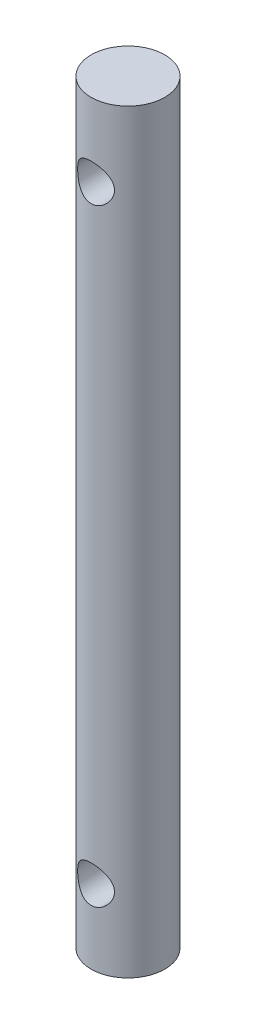
ISO-10303-21;
HEADER;
FILE_DESCRIPTION(('STEP AP214'),'2;1');
FILE_NAME('part.step','',(''),(''),'','','');
FILE_SCHEMA(('AUTOMOTIVE_DESIGN { 1 0 10303 214 1 1 1 1 }'));
ENDSEC;
DATA;
#1=APPLICATION_CONTEXT('core data for automotive mechanical design processes');
#2=APPLICATION_PROTOCOL_DEFINITION('international standard','automotive_design',2000,#1);
#3=PRODUCT_CONTEXT('',#1,'mechanical');
#4=PRODUCT('Part','Part','',(#3));
#5=PRODUCT_RELATED_PRODUCT_CATEGORY('part','',(#4));
#6=PRODUCT_DEFINITION_FORMATION('','',#4);
#7=PRODUCT_DEFINITION_CONTEXT('part definition',#1,'design');
#8=PRODUCT_DEFINITION('design','',#6,#7);
#9=PRODUCT_DEFINITION_SHAPE('','',#8);
#10=(LENGTH_UNIT() NAMED_UNIT(*) SI_UNIT(.MILLI.,.METRE.));
#11=(NAMED_UNIT(*) PLANE_ANGLE_UNIT() SI_UNIT($,.RADIAN.));
#12=(NAMED_UNIT(*) SI_UNIT($,.STERADIAN.) SOLID_ANGLE_UNIT());
#13=UNCERTAINTY_MEASURE_WITH_UNIT(LENGTH_MEASURE(1.E-05),#10,'distance_accuracy_value','');
#14=(GEOMETRIC_REPRESENTATION_CONTEXT(3) GLOBAL_UNCERTAINTY_ASSIGNED_CONTEXT((#13)) GLOBAL_UNIT_ASSIGNED_CONTEXT((#10,
#11,#12)) REPRESENTATION_CONTEXT('',''));
#15=CARTESIAN_POINT('',(0.,0.,0.));
#16=DIRECTION('',(0.,0.,1.));
#17=DIRECTION('',(1.,0.,0.));
#18=AXIS2_PLACEMENT_3D('',#15,#16,#17);
#19=CARTESIAN_POINT('',(0.,130.175,0.767844395721253));
#20=DIRECTION('',(0.,-1.,0.));
#21=DIRECTION('',(0.,0.,-1.));
#22=AXIS2_PLACEMENT_3D('',#19,#20,#21);
#23=CYLINDRICAL_SURFACE('',#22,6.35);
#24=CARTESIAN_POINT('',(0.,120.65,-5.58215560427875));
#25=CARTESIAN_POINT('',(-0.0834969220595,120.649999112282,-5.58215491594319));
#26=CARTESIAN_POINT('',(-0.167002655580043,120.646700125554,-5.58050319339576));
#27=CARTESIAN_POINT('',(-0.333378330258782,120.63355412545,-5.57394666249589));
#28=CARTESIAN_POINT('',(-0.416247978955772,120.623704263474,-5.56904043894988));
#29=CARTESIAN_POINT('',(-0.66318203064701,120.584427934954,-5.549579871762));
#30=CARTESIAN_POINT('',(-0.825450146761555,120.545274922599,-5.53028387727299));
#31=CARTESIAN_POINT('',(-1.13965128900426,120.443009288706,-5.48107383563615));
#32=CARTESIAN_POINT('',(-1.29162180811869,120.379989780757,-5.451201082147));
#33=CARTESIAN_POINT('',(-1.58264035037879,120.232263926371,-5.38358372469512));
#34=CARTESIAN_POINT('',(-1.72168939123018,120.147559289849,-5.34583974143752));
#35=CARTESIAN_POINT('',(-1.99234108848171,119.953030370266,-5.26326656610857));
#36=CARTESIAN_POINT('',(-2.12298433900091,119.841996422206,-5.21814687698693));
#37=CARTESIAN_POINT('',(-2.36467069069853,119.600603316427,-5.12686096018931));
#38=CARTESIAN_POINT('',(-2.47569885601321,119.470229570234,-5.08069396496918));
#39=CARTESIAN_POINT('',(-2.68368848497886,119.181579052247,-4.98839195362339));
#40=CARTESIAN_POINT('',(-2.77889135161933,119.021922468698,-4.94253706604663));
#41=CARTESIAN_POINT('',(-2.90019349951535,118.770452012826,-4.88135319714238));
#42=CARTESIAN_POINT('',(-2.93705266116892,118.684599938171,-4.86221981233807));
#43=CARTESIAN_POINT('',(-3.00322508739606,118.509414386294,-4.82720165281142));
#44=CARTESIAN_POINT('',(-3.03254280972159,118.420083001819,-4.81131496011303));
#45=CARTESIAN_POINT('',(-3.08174263292982,118.243989448035,-4.78428172062924));
#46=CARTESIAN_POINT('',(-3.10208128111978,118.157389205971,-4.77290989565621));
#47=CARTESIAN_POINT('',(-3.13545600360765,117.982412721006,-4.75409215314319));
#48=CARTESIAN_POINT('',(-3.14849595237257,117.894037446228,-4.7466441527901));
#49=CARTESIAN_POINT('',(-3.1670771305344,117.716293261151,-4.73599436210793));
#50=CARTESIAN_POINT('',(-3.17262287599649,117.626924982013,-4.73279001454397));
#51=CARTESIAN_POINT('',(-3.17614778806993,117.448019215822,-4.73075348826484));
#52=CARTESIAN_POINT('',(-3.17412767659871,117.358481745729,-4.73192089240673));
#53=CARTESIAN_POINT('',(-3.1581193033026,117.112252124276,-4.74114750790607));
#54=CARTESIAN_POINT('',(-3.13621253452965,116.956158270187,-4.75376417785582));
#55=CARTESIAN_POINT('',(-3.07003746372168,116.650353358693,-4.79082053480699));
#56=CARTESIAN_POINT('',(-3.02576203854504,116.500644350977,-4.81526398785951));
#57=CARTESIAN_POINT('',(-2.91531509833647,116.207455703436,-4.87373445835111));
#58=CARTESIAN_POINT('',(-2.84865758129417,116.064202390063,-4.90797144304004));
#59=CARTESIAN_POINT('',(-2.69570761526053,115.790233913826,-4.98218829235508));
#60=CARTESIAN_POINT('',(-2.60940634674629,115.659524420391,-5.02217073355679));
#61=CARTESIAN_POINT('',(-2.40685964249565,115.39689572575,-5.10949849446486));
#62=CARTESIAN_POINT('',(-2.28820488335253,115.266924615143,-5.1571345883181));
#63=CARTESIAN_POINT('',(-2.03058898448427,115.027914857136,-5.25029261002779));
#64=CARTESIAN_POINT('',(-1.89161819563547,114.918886213641,-5.29581351966033));
#65=CARTESIAN_POINT('',(-1.58913989972483,114.72009808028,-5.38219371025554));
#66=CARTESIAN_POINT('',(-1.42479265164789,114.63146851442,-5.42273835402447));
#67=CARTESIAN_POINT('',(-1.08098023585583,114.483841918365,-5.49191832727827));
#68=CARTESIAN_POINT('',(-0.901527205073896,114.424821358868,-5.52056311006821));
#69=CARTESIAN_POINT('',(-0.548533610626833,114.342940596601,-5.56070320118232));
#70=CARTESIAN_POINT('',(-0.375734359385244,114.317490327413,-5.5734223955087));
#71=CARTESIAN_POINT('',(-0.0278752299448303,114.29534947774,-5.584473781442));
#72=CARTESIAN_POINT('',(0.14718353806002,114.298645272861,-5.58281278864004));
#73=CARTESIAN_POINT('',(0.480164686080363,114.332406235945,-5.56600095836274));
#74=CARTESIAN_POINT('',(0.638363620564191,114.360745791475,-5.55190565488306));
#75=CARTESIAN_POINT('',(0.947441883053001,114.44045587821,-5.51300954351996));
#76=CARTESIAN_POINT('',(1.09832040207141,114.491828948477,-5.4882075554139));
#77=CARTESIAN_POINT('',(1.39347133182512,114.617495130938,-5.42925558664208));
#78=CARTESIAN_POINT('',(1.53743151047821,114.692401584111,-5.39485860038592));
#79=CARTESIAN_POINT('',(1.8112148234104,114.862316425686,-5.32002678893539));
#80=CARTESIAN_POINT('',(1.94103189959927,114.957333377385,-5.27958939382555));
#81=CARTESIAN_POINT('',(2.19636241342679,115.175539350374,-5.19189163137813));
#82=CARTESIAN_POINT('',(2.32020134681979,115.300578607112,-5.14435119678973));
#83=CARTESIAN_POINT('',(2.54589381918873,115.56976235515,-5.05073653659243));
#84=CARTESIAN_POINT('',(2.6477321493525,115.713919952381,-5.00466334391422));
#85=CARTESIAN_POINT('',(2.83117262876716,116.026068601958,-4.91703095716617));
#86=CARTESIAN_POINT('',(2.91155594998014,116.19487576951,-4.87579841869696));
#87=CARTESIAN_POINT('',(3.04191297152938,116.54634446489,-4.80663239965195));
#88=CARTESIAN_POINT('',(3.09192585492219,116.728987797847,-4.77868179328743));
#89=CARTESIAN_POINT('',(3.15551086037917,117.08418995647,-4.74273326142478));
#90=CARTESIAN_POINT('',(3.17212027309711,117.256033750407,-4.73307752771119));
#91=CARTESIAN_POINT('',(3.17718805563876,117.600244442495,-4.73015561573233));
#92=CARTESIAN_POINT('',(3.16565862768386,117.772611081543,-4.73688233332315));
#93=CARTESIAN_POINT('',(3.11761548073658,118.095660103074,-4.76420771905659));
#94=CARTESIAN_POINT('',(3.08358651207686,118.246843941731,-4.78342383504144));
#95=CARTESIAN_POINT('',(2.99458164828807,118.541190830167,-4.83193538730456));
#96=CARTESIAN_POINT('',(2.93959901505999,118.68435128285,-4.8612340655521));
#97=CARTESIAN_POINT('',(2.8061154442137,118.969233699429,-4.92901136765049));
#98=CARTESIAN_POINT('',(2.72628260503929,119.110212809366,-4.96797449908407));
#99=CARTESIAN_POINT('',(2.54682759156583,119.377697431723,-5.04987767510257));
#100=CARTESIAN_POINT('',(2.44719512169931,119.504195359943,-5.09281978248005));
#101=CARTESIAN_POINT('',(2.21680287661219,119.755097524177,-5.18408314189078));
#102=CARTESIAN_POINT('',(2.08373188558713,119.877379756413,-5.23242400305221));
#103=CARTESIAN_POINT('',(1.79751265125244,120.098397873233,-5.32427906004624));
#104=CARTESIAN_POINT('',(1.64435365457428,120.197121065983,-5.36779064750917));
#105=CARTESIAN_POINT('',(1.40178715704488,120.325280266197,-5.42606633618117));
#106=CARTESIAN_POINT('',(1.31842200030919,120.364800583681,-5.44438733699258));
#107=CARTESIAN_POINT('',(1.14807701021671,120.436599474824,-5.47810923903478));
#108=CARTESIAN_POINT('',(1.06109897786307,120.468881606534,-5.49351157440578));
#109=CARTESIAN_POINT('',(0.884361322813113,120.525759345915,-5.52090657539856));
#110=CARTESIAN_POINT('',(0.794608244970577,120.550371718138,-5.53290667237353));
#111=CARTESIAN_POINT('',(0.612925661591586,120.59166738953,-5.55316543999778));
#112=CARTESIAN_POINT('',(0.520997521680293,120.608355532194,-5.56142639596235));
#113=CARTESIAN_POINT('',(0.357531347524377,120.630616284862,-5.57248063691209));
#114=CARTESIAN_POINT('',(0.286274046488598,120.63787882125,-5.57610231240764));
#115=CARTESIAN_POINT('',(0.143346668941348,120.647571126538,-5.58094012473442));
#116=CARTESIAN_POINT('',(0.0716765810914264,120.650000762047,-5.58215619516927));
#117=CARTESIAN_POINT('',(0.,120.65,-5.58215560427875));
#118=B_SPLINE_CURVE_WITH_KNOTS('',3,(#24,#25,#26,#27,#28,#29,#30,#31,#32,#33,#34,#35,#36,#37,
#38,#39,#40,#41,#42,#43,#44,#45,#46,#47,#48,#49,#50,#51,#52,#53,#54,#55,#56,#57,#58,#59,#60,#61,
#62,#63,#64,#65,#66,#67,#68,#69,#70,#71,#72,#73,#74,#75,#76,#77,#78,#79,#80,#81,#82,#83,#84,#85,
#86,#87,#88,#89,#90,#91,#92,#93,#94,#95,#96,#97,#98,#99,#100,#101,#102,#103,#104,#105,#106,#107,
#108,#109,#110,#111,#112,#113,#114,#115,#116,#117),.UNSPECIFIED.,.T.,.F.,(4,2,2,2,2,2,2,2,2,2,2,
2,2,2,2,2,2,2,2,2,2,2,2,2,2,2,2,2,2,2,2,2,2,2,2,2,2,2,2,2,2,2,2,2,2,2,4),(0.,0.250415612102681,
0.500940186864015,1.00234854488129,1.50182051324263,2.00125310940106,2.53090025348452,
3.06094897410614,3.632102983731,3.9178729000599,4.20347350732851,4.47213270490101,
4.74064915090148,5.00900371453885,5.27733267302574,5.74927594687737,6.22136960256846,
6.70445970327764,7.18776712794021,7.7323564652788,8.27720530143644,8.84735553323665,
9.41705196489304,9.93956405039339,10.4618285011675,10.9436138594975,11.4254523397102,
11.9210677568139,12.4168946391879,12.9614122158798,13.5063050164601,14.0775857365549,
14.6481278321882,15.1639000911419,15.6794487286237,16.1458838633213,16.6124691169503,
17.1104020806943,17.6085946442304,18.1673210354482,18.7263477502426,19.0082017078365,
19.2899168101042,19.5710117490933,19.8519346536844,20.0668939492147,20.2818591776892),.UNSPECIFIED.);
#119=CARTESIAN_POINT('',(0.,120.65,-5.58215560427875));
#120=VERTEX_POINT('',#119);
#121=EDGE_CURVE('E11',#120,#120,#118,.T.);
#122=ORIENTED_EDGE('',*,*,#121,.T.);
#123=EDGE_LOOP('',(#122));
#124=FACE_BOUND('',#123,.T.);
#125=CARTESIAN_POINT('',(3.175,117.475,6.26710570975244));
#126=CARTESIAN_POINT('',(3.17499905676822,117.392238086467,6.26710672449038));
#127=CARTESIAN_POINT('',(3.17175738528249,117.309466084958,6.26898254666068));
#128=CARTESIAN_POINT('',(3.15884523354688,117.144579787141,6.2764051724258));
#129=CARTESIAN_POINT('',(3.1491717603564,117.062465815049,6.28195368504562));
#130=CARTESIAN_POINT('',(3.11062065473092,116.817834251589,6.30386118496228));
#131=CARTESIAN_POINT('',(3.07221261154103,116.657171953019,6.32548162314761));
#132=CARTESIAN_POINT('',(2.97211747978078,116.346402187854,6.37963305070438));
#133=CARTESIAN_POINT('',(2.9105541372517,116.196243559814,6.41210594158755));
#134=CARTESIAN_POINT('',(2.76627435445934,115.9083885772,6.4841998346217));
#135=CARTESIAN_POINT('',(2.68355676984061,115.770692897366,6.52382122344217));
#136=CARTESIAN_POINT('',(2.49131627779835,115.49917617866,6.6097447383962));
#137=CARTESIAN_POINT('',(2.38014521787044,115.366611402718,6.65632834910434));
#138=CARTESIAN_POINT('',(2.13758083606043,115.121029208745,6.74865491632271));
#139=CARTESIAN_POINT('',(2.00617748851801,115.008021541095,6.79439744340407));
#140=CARTESIAN_POINT('',(1.71605436473864,114.79730904715,6.88357626918698));
#141=CARTESIAN_POINT('',(1.55609032527603,114.70114922106,6.92664926918252));
#142=CARTESIAN_POINT('',(1.21969855929244,114.537677856889,7.00198090719364));
#143=CARTESIAN_POINT('',(1.04328130884119,114.470348112814,7.03424636728233));
#144=CARTESIAN_POINT('',(0.692292696730407,114.371422685461,7.08229903885362));
#145=CARTESIAN_POINT('',(0.518483183758185,114.337625253206,7.0990953920244));
#146=CARTESIAN_POINT('',(0.166911747158863,114.299472573822,7.11808518354362));
#147=CARTESIAN_POINT('',(-0.0108477196166707,114.295099512243,7.12028745759956));
#148=CARTESIAN_POINT('',(-0.348718268640207,114.315070701205,7.11031907022859));
#149=CARTESIAN_POINT('',(-0.509019820270684,114.336950743216,7.09938163576222));
#150=CARTESIAN_POINT('',(-0.823321212955326,114.404396635458,7.0662266872537));
#151=CARTESIAN_POINT('',(-0.97732058152526,114.449964258087,7.04400832913163));
#152=CARTESIAN_POINT('',(-1.27733236684466,114.563787314023,6.98994214806944));
#153=CARTESIAN_POINT('',(-1.42320480220676,114.632347920521,6.95796535032441));
#154=CARTESIAN_POINT('',(-1.70172616219331,114.789785720016,6.88726471977041));
#155=CARTESIAN_POINT('',(-1.83437032813194,114.878670186648,6.84853847260754));
#156=CARTESIAN_POINT('',(-2.09605211974366,115.083895301586,6.76365365642933));
#157=CARTESIAN_POINT('',(-2.22356359612796,115.202037090429,6.71713856499948));
#158=CARTESIAN_POINT('',(-2.45777846555886,115.45756239352,6.62427072879644));
#159=CARTESIAN_POINT('',(-2.56446584928023,115.59496057354,6.5779181356239));
#160=CARTESIAN_POINT('',(-2.76069102698817,115.895947768369,6.48741729176472));
#161=CARTESIAN_POINT('',(-2.84870951352546,116.060645911059,6.44359595324914));
#162=CARTESIAN_POINT('',(-2.95849503046443,116.318837566131,6.38669686987964));
#163=CARTESIAN_POINT('',(-2.99138760520285,116.406777928512,6.36919999613122));
#164=CARTESIAN_POINT('',(-3.04938956554735,116.585797438211,6.33783657320752));
#165=CARTESIAN_POINT('',(-3.07450375064138,116.676874611319,6.32396778622354));
#166=CARTESIAN_POINT('',(-3.11492823782859,116.854151631404,6.30139797159841));
#167=CARTESIAN_POINT('',(-3.13085491331031,116.940170642133,6.29237595800693));
#168=CARTESIAN_POINT('',(-3.15556797554225,117.113510627588,6.27829753063591));
#169=CARTESIAN_POINT('',(-3.16435807553686,117.200830901134,6.27323905462891));
#170=CARTESIAN_POINT('',(-3.17466835867006,117.376015148866,6.26730066102777));
#171=CARTESIAN_POINT('',(-3.17619124884848,117.46387890839,6.26641918749866));
#172=CARTESIAN_POINT('',(-3.17195985852084,117.639344837643,6.26885948375424));
#173=CARTESIAN_POINT('',(-3.16620606921981,117.726947024628,6.2721809698223));
#174=CARTESIAN_POINT('',(-3.14018226453033,117.969092585645,6.2871002800797));
#175=CARTESIAN_POINT('',(-3.11209439281023,118.122605607529,6.30313051271152));
#176=CARTESIAN_POINT('',(-3.03433762958359,118.422346880593,6.34612536495718));
#177=CARTESIAN_POINT('',(-2.98466174914483,118.56857275552,6.37309352544235));
#178=CARTESIAN_POINT('',(-2.86273054239685,118.857422626649,6.43637065361084));
#179=CARTESIAN_POINT('',(-2.78953600385261,118.999566132032,6.47305439342265));
#180=CARTESIAN_POINT('',(-2.62346157669833,119.270367184771,6.55130086485765));
#181=CARTESIAN_POINT('',(-2.53057157570877,119.399017753442,6.59286609791076));
#182=CARTESIAN_POINT('',(-2.31405795861388,119.656156871519,6.68248845012277));
#183=CARTESIAN_POINT('',(-2.18803622695199,119.782580761702,6.73070343861806));
#184=CARTESIAN_POINT('',(-1.91580928554187,120.01313404752,6.82365632851185));
#185=CARTESIAN_POINT('',(-1.76959728537412,120.117255912323,6.86839305214996));
#186=CARTESIAN_POINT('',(-1.45584977269244,120.302571526682,6.95088263717487));
#187=CARTESIAN_POINT('',(-1.28785333421913,120.383087636826,6.98842002103909));
#188=CARTESIAN_POINT('',(-0.938283508313609,120.513912858229,7.05064091345011));
#189=CARTESIAN_POINT('',(-0.756722200806244,120.564248493874,7.0753357062863));
#190=CARTESIAN_POINT('',(-0.403160492410786,120.62894519054,7.10728778154941));
#191=CARTESIAN_POINT('',(-0.231811338563333,120.646183264302,7.11593710898784));
#192=CARTESIAN_POINT('',(0.111525009731684,120.652677359425,7.11918203295091));
#193=CARTESIAN_POINT('',(0.28351195976931,120.641943176285,7.11378254917615));
#194=CARTESIAN_POINT('',(0.611308110350747,120.594702940442,7.09034791348881));
#195=CARTESIAN_POINT('',(0.767436553820506,120.559941720137,7.07316882723711));
#196=CARTESIAN_POINT('',(1.07139095342116,120.467986660666,7.02869334372406));
#197=CARTESIAN_POINT('',(1.21921571544173,120.410789604509,7.00139549560217));
#198=CARTESIAN_POINT('',(1.50946910032131,120.273042062138,6.93769279716902));
#199=CARTESIAN_POINT('',(1.65139651176318,120.191597371874,6.90094837306771));
#200=CARTESIAN_POINT('',(1.92016030444461,120.008781845671,6.82219224151419));
#201=CARTESIAN_POINT('',(2.04698971133066,119.907401857745,6.78017811804515));
#202=CARTESIAN_POINT('',(2.29524860659569,119.675926168705,6.69012933822699));
#203=CARTESIAN_POINT('',(2.41488454123001,119.543976768848,6.6419116364774));
#204=CARTESIAN_POINT('',(2.63101905620371,119.261066269459,6.54834093636534));
#205=CARTESIAN_POINT('',(2.7274971667743,119.110088528742,6.50299049833464));
#206=CARTESIAN_POINT('',(2.85396050304135,118.869320518756,6.44056159682021));
#207=CARTESIAN_POINT('',(2.89354057606826,118.785242277294,6.42041563170916));
#208=CARTESIAN_POINT('',(2.96535747654718,118.613392775482,6.38307301647894));
#209=CARTESIAN_POINT('',(2.99759808643801,118.525623445117,6.3658748483282));
#210=CARTESIAN_POINT('',(3.0542719435453,118.347230991575,6.33515626365955));
#211=CARTESIAN_POINT('',(3.07872527562275,118.25661588317,6.3216263995258));
#212=CARTESIAN_POINT('',(3.11956903021308,118.073111521459,6.29878826592036));
#213=CARTESIAN_POINT('',(3.13596509002515,117.980223906026,6.28947704521671));
#214=CARTESIAN_POINT('',(3.15710761797221,117.818536251204,6.27740631722533));
#215=CARTESIAN_POINT('',(3.16381073091702,117.75006632724,6.27355307977905));
#216=CARTESIAN_POINT('',(3.17275746355016,117.612733281387,6.26840226835251));
#217=CARTESIAN_POINT('',(3.17500078490812,117.543870133503,6.26710486534062));
#218=CARTESIAN_POINT('',(3.175,117.475,6.26710570975244));
#219=B_SPLINE_CURVE_WITH_KNOTS('',3,(#125,#126,#127,#128,#129,#130,#131,#132,#133,#134,#135,
#136,#137,#138,#139,#140,#141,#142,#143,#144,#145,#146,#147,#148,#149,#150,#151,#152,#153,#154,
#155,#156,#157,#158,#159,#160,#161,#162,#163,#164,#165,#166,#167,#168,#169,#170,#171,#172,#173,
#174,#175,#176,#177,#178,#179,#180,#181,#182,#183,#184,#185,#186,#187,#188,#189,#190,#191,#192,
#193,#194,#195,#196,#197,#198,#199,#200,#201,#202,#203,#204,#205,#206,#207,#208,#209,#210,#211,
#212,#213,#214,#215,#216,#217,#218),.UNSPECIFIED.,.T.,.F.,(4,2,2,2,2,2,2,2,2,2,2,2,2,2,2,2,2,2,
2,2,2,2,2,2,2,2,2,2,2,2,2,2,2,2,2,2,2,2,2,2,2,2,2,2,2,2,4),(0.,0.248210314193373,
0.496536210172851,0.993616655653378,1.48807751301479,1.98256512428753,2.51783706318106,
3.05337510292795,3.62501229957991,4.19628797710271,4.72691486873111,5.25722047303094,
5.74141031613326,6.22563639342838,6.71656194871308,7.2076634753703,7.74518754975544,
8.28312325280708,8.85521994590916,9.14138502893469,9.42737318655796,9.69083660833536,
9.95416285897608,10.2173910127767,10.4806013985705,10.9489167635524,11.4173838546846,
11.9075481007329,12.3979646273261,12.9502005485241,13.5026226528975,14.0696241997013,
14.6361266987681,15.1506510247058,15.6649951955482,16.1454469295095,16.625967578846,
17.1270402751828,17.6283435455375,18.1795366185793,18.7312151251733,19.0161455987001,
19.3009288973909,19.5849716229022,19.8688153329579,20.075349152287,20.2818967868888),.UNSPECIFIED.);
#220=CARTESIAN_POINT('',(3.175,117.475,6.26710570975244));
#221=VERTEX_POINT('',#220);
#222=EDGE_CURVE('E61',#221,#221,#219,.T.);
#223=ORIENTED_EDGE('',*,*,#222,.T.);
#224=EDGE_LOOP('',(#223));
#225=FACE_BOUND('',#224,.T.);
#226=CARTESIAN_POINT('',(0.,15.875,-5.58215560427875));
#227=CARTESIAN_POINT('',(-0.0834969220594996,15.8749991122824,-5.58215491594319));
#228=CARTESIAN_POINT('',(-0.167002655580042,15.871700125554,-5.58050319339576));
#229=CARTESIAN_POINT('',(-0.33337833025878,15.8585541254501,-5.57394666249589));
#230=CARTESIAN_POINT('',(-0.416247978955771,15.8487042634742,-5.56904043894988));
#231=CARTESIAN_POINT('',(-0.663182030647009,15.809427934954,-5.549579871762));
#232=CARTESIAN_POINT('',(-0.825450146761554,15.7702749225986,-5.53028387727299));
#233=CARTESIAN_POINT('',(-1.13965128900426,15.6680092887058,-5.48107383563615));
#234=CARTESIAN_POINT('',(-1.29162180811868,15.6049897807566,-5.451201082147));
#235=CARTESIAN_POINT('',(-1.58264035037879,15.4572639263711,-5.38358372469512));
#236=CARTESIAN_POINT('',(-1.72168939123018,15.372559289849,-5.34583974143752));
#237=CARTESIAN_POINT('',(-1.99234108848171,15.1780303702658,-5.26326656610857));
#238=CARTESIAN_POINT('',(-2.12298433900091,15.0669964222061,-5.21814687698693));
#239=CARTESIAN_POINT('',(-2.36467069069853,14.8256033164272,-5.12686096018931));
#240=CARTESIAN_POINT('',(-2.47569885601321,14.6952295702336,-5.08069396496918));
#241=CARTESIAN_POINT('',(-2.68368848497886,14.4065790522467,-4.98839195362339));
#242=CARTESIAN_POINT('',(-2.77889135161933,14.2469224686984,-4.94253706604663));
#243=CARTESIAN_POINT('',(-2.90019349951534,13.9954520128256,-4.88135319714238));
#244=CARTESIAN_POINT('',(-2.93705266116891,13.9095999381713,-4.86221981233808));
#245=CARTESIAN_POINT('',(-3.00322508739606,13.7344143862936,-4.82720165281142));
#246=CARTESIAN_POINT('',(-3.03254280972158,13.6450830018194,-4.81131496011304));
#247=CARTESIAN_POINT('',(-3.08174263292982,13.4689894480353,-4.78428172062924));
#248=CARTESIAN_POINT('',(-3.10208128111978,13.3823892059714,-4.77290989565621));
#249=CARTESIAN_POINT('',(-3.13545600360764,13.2074127210056,-4.75409215314319));
#250=CARTESIAN_POINT('',(-3.14849595237257,13.1190374462283,-4.7466441527901));
#251=CARTESIAN_POINT('',(-3.1670771305344,12.9412932611514,-4.73599436210794));
#252=CARTESIAN_POINT('',(-3.17262287599649,12.8519249820126,-4.73279001454397));
#253=CARTESIAN_POINT('',(-3.17614778806993,12.6730192158219,-4.73075348826484));
#254=CARTESIAN_POINT('',(-3.17412767659871,12.5834817457287,-4.73192089240674));
#255=CARTESIAN_POINT('',(-3.1581193033026,12.3372521242756,-4.74114750790608));
#256=CARTESIAN_POINT('',(-3.13621253452965,12.1811582701866,-4.75376417785582));
#257=CARTESIAN_POINT('',(-3.07003746372167,11.8753533586935,-4.79082053480699));
#258=CARTESIAN_POINT('',(-3.02576203854504,11.7256443509772,-4.81526398785952));
#259=CARTESIAN_POINT('',(-2.91531509833646,11.4324557034359,-4.87373445835112));
#260=CARTESIAN_POINT('',(-2.84865758129417,11.2892023900634,-4.90797144304004));
#261=CARTESIAN_POINT('',(-2.69570761526053,11.015233913826,-4.98218829235508));
#262=CARTESIAN_POINT('',(-2.60940634674628,10.8845244203915,-5.02217073355679));
#263=CARTESIAN_POINT('',(-2.40685964249564,10.6218957257497,-5.10949849446486));
#264=CARTESIAN_POINT('',(-2.28820488335252,10.4919246151435,-5.15713458831811));
#265=CARTESIAN_POINT('',(-2.03058898448426,10.2529148571362,-5.2502926100278));
#266=CARTESIAN_POINT('',(-1.89161819563545,10.1438862136413,-5.29581351966033));
#267=CARTESIAN_POINT('',(-1.58913989972482,9.94509808028028,-5.38219371025555));
#268=CARTESIAN_POINT('',(-1.42479265164787,9.85646851442005,-5.42273835402447));
#269=CARTESIAN_POINT('',(-1.08098023585582,9.70884191836465,-5.49191832727827));
#270=CARTESIAN_POINT('',(-0.901527205073886,9.64982135886829,-5.52056311006821));
#271=CARTESIAN_POINT('',(-0.548533610626825,9.56794059660095,-5.56070320118232));
#272=CARTESIAN_POINT('',(-0.375734359385236,9.54249032741266,-5.5734223955087));
#273=CARTESIAN_POINT('',(-0.0278752299448229,9.52034947773974,-5.584473781442));
#274=CARTESIAN_POINT('',(0.147183538060028,9.52364527286068,-5.58281278864004));
#275=CARTESIAN_POINT('',(0.480164686080371,9.55740623594539,-5.56600095836274));
#276=CARTESIAN_POINT('',(0.638363620564199,9.58574579147484,-5.55190565488305));
#277=CARTESIAN_POINT('',(0.947441883053009,9.6654558782099,-5.51300954351996));
#278=CARTESIAN_POINT('',(1.09832040207142,9.71682894847729,-5.4882075554139));
#279=CARTESIAN_POINT('',(1.39347133182513,9.8424951309378,-5.42925558664208));
#280=CARTESIAN_POINT('',(1.53743151047823,9.9174015841112,-5.39485860038592));
#281=CARTESIAN_POINT('',(1.81121482341041,10.0873164256859,-5.32002678893539));
#282=CARTESIAN_POINT('',(1.94103189959928,10.1823333773854,-5.27958939382554));
#283=CARTESIAN_POINT('',(2.1963624134268,10.4005393503738,-5.19189163137813));
#284=CARTESIAN_POINT('',(2.32020134681981,10.5255786071116,-5.14435119678972));
#285=CARTESIAN_POINT('',(2.54589381918874,10.7947623551498,-5.05073653659243));
#286=CARTESIAN_POINT('',(2.64773214935251,10.9389199523809,-5.00466334391421));
#287=CARTESIAN_POINT('',(2.83117262876717,11.2510686019584,-4.91703095716616));
#288=CARTESIAN_POINT('',(2.91155594998015,11.4198757695104,-4.87579841869695));
#289=CARTESIAN_POINT('',(3.04191297152939,11.7713444648897,-4.80663239965194));
#290=CARTESIAN_POINT('',(3.0919258549222,11.9539877978474,-4.77868179328743));
#291=CARTESIAN_POINT('',(3.15551086037918,12.3091899564702,-4.74273326142477));
#292=CARTESIAN_POINT('',(3.17212027309712,12.4810337504072,-4.73307752771119));
#293=CARTESIAN_POINT('',(3.17718805563877,12.8252444424952,-4.73015561573233));
#294=CARTESIAN_POINT('',(3.16565862768386,12.9976110815426,-4.73688233332315));
#295=CARTESIAN_POINT('',(3.11761548073658,13.3206601030739,-4.76420771905659));
#296=CARTESIAN_POINT('',(3.08358651207687,13.4718439417311,-4.78342383504144));
#297=CARTESIAN_POINT('',(2.99458164828807,13.7661908301672,-4.83193538730456));
#298=CARTESIAN_POINT('',(2.93959901505999,13.9093512828503,-4.86123406555209));
#299=CARTESIAN_POINT('',(2.8061154442137,14.1942336994285,-4.92901136765049));
#300=CARTESIAN_POINT('',(2.72628260503929,14.3352128093657,-4.96797449908407));
#301=CARTESIAN_POINT('',(2.54682759156583,14.6026974317231,-5.04987767510257));
#302=CARTESIAN_POINT('',(2.44719512169931,14.7291953599427,-5.09281978248005));
#303=CARTESIAN_POINT('',(2.21680287661219,14.9800975241771,-5.18408314189078));
#304=CARTESIAN_POINT('',(2.08373188558713,15.1023797564128,-5.23242400305221));
#305=CARTESIAN_POINT('',(1.79751265125244,15.3233978732331,-5.32427906004625));
#306=CARTESIAN_POINT('',(1.64435365457428,15.4221210659827,-5.36779064750917));
#307=CARTESIAN_POINT('',(1.40178715704487,15.5502802661971,-5.42606633618117));
#308=CARTESIAN_POINT('',(1.31842200030919,15.5898005836814,-5.44438733699258));
#309=CARTESIAN_POINT('',(1.14807701021671,15.6615994748237,-5.47810923903478));
#310=CARTESIAN_POINT('',(1.06109897786306,15.6938816065344,-5.49351157440578));
#311=CARTESIAN_POINT('',(0.884361322813111,15.750759345915,-5.52090657539856));
#312=CARTESIAN_POINT('',(0.794608244970574,15.7753717181381,-5.53290667237353));
#313=CARTESIAN_POINT('',(0.612925661591584,15.8166673895299,-5.55316543999778));
#314=CARTESIAN_POINT('',(0.520997521680292,15.8333555321935,-5.56142639596235));
#315=CARTESIAN_POINT('',(0.357531347524376,15.8556162848624,-5.57248063691209));
#316=CARTESIAN_POINT('',(0.286274046488597,15.8628788212496,-5.57610231240764));
#317=CARTESIAN_POINT('',(0.143346668941347,15.8725711265376,-5.58094012473442));
#318=CARTESIAN_POINT('',(0.0716765810914259,15.8750007620468,-5.58215619516927));
#319=CARTESIAN_POINT('',(0.,15.875,-5.58215560427875));
#320=B_SPLINE_CURVE_WITH_KNOTS('',3,(#226,#227,#228,#229,#230,#231,#232,#233,#234,#235,#236,
#237,#238,#239,#240,#241,#242,#243,#244,#245,#246,#247,#248,#249,#250,#251,#252,#253,#254,#255,
#256,#257,#258,#259,#260,#261,#262,#263,#264,#265,#266,#267,#268,#269,#270,#271,#272,#273,#274,
#275,#276,#277,#278,#279,#280,#281,#282,#283,#284,#285,#286,#287,#288,#289,#290,#291,#292,#293,
#294,#295,#296,#297,#298,#299,#300,#301,#302,#303,#304,#305,#306,#307,#308,#309,#310,#311,#312,
#313,#314,#315,#316,#317,#318,#319),.UNSPECIFIED.,.T.,.F.,(4,2,2,2,2,2,2,2,2,2,2,2,2,2,2,2,2,2,
2,2,2,2,2,2,2,2,2,2,2,2,2,2,2,2,2,2,2,2,2,2,2,2,2,2,2,2,4),(0.,0.25041561210268,
0.500940186864013,1.00234854488129,1.50182051324263,2.00125310940106,2.53090025348452,
3.06094897410615,3.63210298373098,3.91787290005989,4.20347350732849,4.47213270490102,
4.74064915090148,5.00900371453887,5.27733267302576,5.74927594687738,6.22136960256846,
6.70445970327764,7.18776712794021,7.73235646527881,8.27720530143646,8.84735553323666,
9.41705196489304,9.93956405039339,10.4618285011675,10.9436138594975,11.4254523397102,
11.9210677568139,12.4168946391879,12.9614122158798,13.5063050164601,14.0775857365549,
14.6481278321882,15.1639000911419,15.6794487286237,16.1458838633213,16.6124691169503,
17.1104020806943,17.6085946442304,18.1673210354482,18.7263477502426,19.0082017078365,
19.2899168101042,19.5710117490933,19.8519346536844,20.0668939492148,20.2818591776892),.UNSPECIFIED.);
#321=CARTESIAN_POINT('',(0.,15.875,-5.58215560427875));
#322=VERTEX_POINT('',#321);
#323=EDGE_CURVE('E42',#322,#322,#320,.T.);
#324=ORIENTED_EDGE('',*,*,#323,.T.);
#325=EDGE_LOOP('',(#324));
#326=FACE_BOUND('',#325,.T.);
#327=CARTESIAN_POINT('',(3.17500000000001,12.7,6.26710570975244));
#328=CARTESIAN_POINT('',(3.17499905676823,12.6172380864675,6.26710672449038));
#329=CARTESIAN_POINT('',(3.1717573852825,12.5344660849583,6.26898254666067));
#330=CARTESIAN_POINT('',(3.15884523354689,12.3695797871413,6.2764051724258));
#331=CARTESIAN_POINT('',(3.14917176035641,12.2874658150492,6.28195368504562));
#332=CARTESIAN_POINT('',(3.11062065473093,12.0428342515892,6.30386118496227));
#333=CARTESIAN_POINT('',(3.07221261154103,11.882171953019,6.32548162314761));
#334=CARTESIAN_POINT('',(2.97211747978078,11.5714021878542,6.37963305070438));
#335=CARTESIAN_POINT('',(2.9105541372517,11.4212435598136,6.41210594158755));
#336=CARTESIAN_POINT('',(2.76627435445935,11.1333885772,6.4841998346217));
#337=CARTESIAN_POINT('',(2.68355676984061,10.9956928973657,6.52382122344217));
#338=CARTESIAN_POINT('',(2.49131627779835,10.7241761786603,6.6097447383962));
#339=CARTESIAN_POINT('',(2.38014521787044,10.5916114027183,6.65632834910434));
#340=CARTESIAN_POINT('',(2.13758083606043,10.3460292087452,6.74865491632271));
#341=CARTESIAN_POINT('',(2.00617748851801,10.233021541095,6.79439744340407));
#342=CARTESIAN_POINT('',(1.71605436473864,10.0223090471499,6.88357626918698));
#343=CARTESIAN_POINT('',(1.55609032527603,9.92614922106035,6.92664926918252));
#344=CARTESIAN_POINT('',(1.21969855929244,9.76267785688862,7.00198090719364));
#345=CARTESIAN_POINT('',(1.0432813088412,9.69534811281404,7.03424636728234));
#346=CARTESIAN_POINT('',(0.692292696730409,9.59642268546146,7.08229903885362));
#347=CARTESIAN_POINT('',(0.518483183758185,9.56262525320581,7.0990953920244));
#348=CARTESIAN_POINT('',(0.166911747158861,9.52447257382175,7.11808518354362));
#349=CARTESIAN_POINT('',(-0.0108477196166729,9.52009951224336,7.12028745759956));
#350=CARTESIAN_POINT('',(-0.348718268640207,9.54007070120517,7.11031907022859));
#351=CARTESIAN_POINT('',(-0.509019820270683,9.56195074321593,7.09938163576222));
#352=CARTESIAN_POINT('',(-0.823321212955323,9.62939663545795,7.0662266872537));
#353=CARTESIAN_POINT('',(-0.977320581525258,9.67496425808659,7.04400832913163));
#354=CARTESIAN_POINT('',(-1.27733236684465,9.7887873140228,6.98994214806944));
#355=CARTESIAN_POINT('',(-1.42320480220676,9.85734792052068,6.95796535032441));
#356=CARTESIAN_POINT('',(-1.7017261621933,10.0147857200159,6.88726471977041));
#357=CARTESIAN_POINT('',(-1.83437032813193,10.1036701866477,6.84853847260754));
#358=CARTESIAN_POINT('',(-2.09605211974366,10.308895301586,6.76365365642933));
#359=CARTESIAN_POINT('',(-2.22356359612796,10.4270370904291,6.71713856499948));
#360=CARTESIAN_POINT('',(-2.45777846555886,10.6825623935202,6.62427072879643));
#361=CARTESIAN_POINT('',(-2.56446584928023,10.8199605735396,6.5779181356239));
#362=CARTESIAN_POINT('',(-2.76069102698817,11.1209477683689,6.48741729176472));
#363=CARTESIAN_POINT('',(-2.84870951352546,11.2856459110587,6.44359595324915));
#364=CARTESIAN_POINT('',(-2.95849503046442,11.5438375661308,6.38669686987964));
#365=CARTESIAN_POINT('',(-2.99138760520284,11.6317779285117,6.36919999613122));
#366=CARTESIAN_POINT('',(-3.04938956554735,11.8107974382114,6.33783657320752));
#367=CARTESIAN_POINT('',(-3.07450375064137,11.9018746113191,6.32396778622355));
#368=CARTESIAN_POINT('',(-3.11492823782858,12.0791516314038,6.30139797159841));
#369=CARTESIAN_POINT('',(-3.13085491331031,12.1651706421334,6.29237595800693));
#370=CARTESIAN_POINT('',(-3.15556797554224,12.3385106275881,6.27829753063591));
#371=CARTESIAN_POINT('',(-3.16435807553685,12.4258309011336,6.27323905462891));
#372=CARTESIAN_POINT('',(-3.17466835867006,12.6010151488662,6.26730066102777));
#373=CARTESIAN_POINT('',(-3.17619124884848,12.6888789083904,6.26641918749866));
#374=CARTESIAN_POINT('',(-3.17195985852084,12.8643448376426,6.26885948375424));
#375=CARTESIAN_POINT('',(-3.16620606921981,12.9519470246276,6.2721809698223));
#376=CARTESIAN_POINT('',(-3.14018226453033,13.1940925856452,6.28710028007971));
#377=CARTESIAN_POINT('',(-3.11209439281023,13.3476056075286,6.30313051271152));
#378=CARTESIAN_POINT('',(-3.03433762958359,13.6473468805933,6.34612536495718));
#379=CARTESIAN_POINT('',(-2.98466174914483,13.7935727555203,6.37309352544235));
#380=CARTESIAN_POINT('',(-2.86273054239684,14.0824226266486,6.43637065361084));
#381=CARTESIAN_POINT('',(-2.78953600385261,14.2245661320318,6.47305439342265));
#382=CARTESIAN_POINT('',(-2.62346157669832,14.4953671847707,6.55130086485766));
#383=CARTESIAN_POINT('',(-2.53057157570876,14.6240177534421,6.59286609791076));
#384=CARTESIAN_POINT('',(-2.31405795861387,14.8811568715187,6.68248845012278));
#385=CARTESIAN_POINT('',(-2.18803622695198,15.0075807617025,6.73070343861806));
#386=CARTESIAN_POINT('',(-1.91580928554186,15.2381340475204,6.82365632851185));
#387=CARTESIAN_POINT('',(-1.76959728537411,15.3422559123232,6.86839305214996));
#388=CARTESIAN_POINT('',(-1.45584977269243,15.5275715266821,6.95088263717488));
#389=CARTESIAN_POINT('',(-1.28785333421912,15.6080876368263,6.98842002103909));
#390=CARTESIAN_POINT('',(-0.938283508313603,15.7389128582287,7.05064091345011));
#391=CARTESIAN_POINT('',(-0.756722200806239,15.7892484938744,7.0753357062863));
#392=CARTESIAN_POINT('',(-0.403160492410781,15.8539451905403,7.10728778154941));
#393=CARTESIAN_POINT('',(-0.231811338563328,15.8711832643018,7.11593710898784));
#394=CARTESIAN_POINT('',(0.111525009731688,15.8776773594255,7.11918203295091));
#395=CARTESIAN_POINT('',(0.283511959769315,15.8669431762855,7.11378254917615));
#396=CARTESIAN_POINT('',(0.611308110350751,15.819702940442,7.09034791348881));
#397=CARTESIAN_POINT('',(0.76743655382051,15.7849417201372,7.07316882723711));
#398=CARTESIAN_POINT('',(1.07139095342117,15.6929866606661,7.02869334372406));
#399=CARTESIAN_POINT('',(1.21921571544173,15.6357896045092,7.00139549560217));
#400=CARTESIAN_POINT('',(1.50946910032132,15.4980420621378,6.93769279716902));
#401=CARTESIAN_POINT('',(1.65139651176319,15.4165973718741,6.90094837306771));
#402=CARTESIAN_POINT('',(1.92016030444463,15.2337818456706,6.82219224151418));
#403=CARTESIAN_POINT('',(2.04698971133067,15.1324018577453,6.78017811804515));
#404=CARTESIAN_POINT('',(2.29524860659569,14.9009261687049,6.69012933822698));
#405=CARTESIAN_POINT('',(2.41488454123002,14.7689767688479,6.6419116364774));
#406=CARTESIAN_POINT('',(2.63101905620372,14.4860662694591,6.54834093636534));
#407=CARTESIAN_POINT('',(2.7274971667743,14.3350885287421,6.50299049833464));
#408=CARTESIAN_POINT('',(2.85396050304135,14.0943205187556,6.44056159682021));
#409=CARTESIAN_POINT('',(2.89354057606826,14.0102422772936,6.42041563170916));
#410=CARTESIAN_POINT('',(2.96535747654718,13.8383927754824,6.38307301647893));
#411=CARTESIAN_POINT('',(2.99759808643802,13.7506234451167,6.36587484832819));
#412=CARTESIAN_POINT('',(3.05427194354531,13.5722309915753,6.33515626365955));
#413=CARTESIAN_POINT('',(3.07872527562276,13.4816158831696,6.3216263995258));
#414=CARTESIAN_POINT('',(3.11956903021309,13.2981115214591,6.29878826592036));
#415=CARTESIAN_POINT('',(3.13596509002516,13.2052239060257,6.28947704521671));
#416=CARTESIAN_POINT('',(3.15710761797221,13.0435362512041,6.27740631722533));
#417=CARTESIAN_POINT('',(3.16381073091703,12.9750663272401,6.27355307977905));
#418=CARTESIAN_POINT('',(3.17275746355017,12.837733281387,6.26840226835251));
#419=CARTESIAN_POINT('',(3.17500078490813,12.7688701335028,6.26710486534062));
#420=CARTESIAN_POINT('',(3.17500000000001,12.7,6.26710570975244));
#421=B_SPLINE_CURVE_WITH_KNOTS('',3,(#327,#328,#329,#330,#331,#332,#333,#334,#335,#336,#337,
#338,#339,#340,#341,#342,#343,#344,#345,#346,#347,#348,#349,#350,#351,#352,#353,#354,#355,#356,
#357,#358,#359,#360,#361,#362,#363,#364,#365,#366,#367,#368,#369,#370,#371,#372,#373,#374,#375,
#376,#377,#378,#379,#380,#381,#382,#383,#384,#385,#386,#387,#388,#389,#390,#391,#392,#393,#394,
#395,#396,#397,#398,#399,#400,#401,#402,#403,#404,#405,#406,#407,#408,#409,#410,#411,#412,#413,
#414,#415,#416,#417,#418,#419,#420),.UNSPECIFIED.,.T.,.F.,(4,2,2,2,2,2,2,2,2,2,2,2,2,2,2,2,2,2,
2,2,2,2,2,2,2,2,2,2,2,2,2,2,2,2,2,2,2,2,2,2,2,2,2,2,2,2,4),(0.,0.248210314193369,
0.496536210172844,0.993616655653378,1.48807751301481,1.98256512428753,2.51783706318107,
3.05337510292796,3.62501229957992,4.19628797710272,4.72691486873112,5.25722047303095,
5.74141031613327,6.22563639342838,6.71656194871309,7.20766347537031,7.74518754975546,
8.28312325280709,8.85521994590916,9.14138502893469,9.42737318655796,9.69083660833536,
9.95416285897606,10.2173910127766,10.4806013985705,10.9489167635524,11.4173838546846,
11.9075481007329,12.3979646273261,12.9502005485241,13.5026226528976,14.0696241997013,
14.6361266987681,15.1506510247058,15.6649951955482,16.1454469295095,16.625967578846,
17.1270402751829,17.6283435455375,18.1795366185793,18.7312151251733,19.0161455987001,
19.3009288973909,19.5849716229022,19.8688153329579,20.075349152287,20.2818967868888),.UNSPECIFIED.);
#422=CARTESIAN_POINT('',(3.17500000000001,12.7,6.26710570975244));
#423=VERTEX_POINT('',#422);
#424=EDGE_CURVE('E57',#423,#423,#421,.T.);
#425=ORIENTED_EDGE('',*,*,#424,.T.);
#426=EDGE_LOOP('',(#425));
#427=FACE_BOUND('',#426,.T.);
#428=CARTESIAN_POINT('',(0.,130.175,0.767844395721253));
#429=DIRECTION('',(0.,1.,0.));
#430=DIRECTION('',(0.,0.,1.));
#431=AXIS2_PLACEMENT_3D('',#428,#429,#430);
#432=CIRCLE('',#431,6.35);
#433=CARTESIAN_POINT('',(0.,130.175,7.11784439572125));
#434=VERTEX_POINT('',#433);
#435=EDGE_CURVE('E46',#434,#434,#432,.T.);
#436=ORIENTED_EDGE('',*,*,#435,.F.);
#437=EDGE_LOOP('',(#436));
#438=FACE_BOUND('',#437,.T.);
#439=CARTESIAN_POINT('',(0.,0.,0.767844395721253));
#440=DIRECTION('',(0.,1.,0.));
#441=DIRECTION('',(0.,0.,1.));
#442=AXIS2_PLACEMENT_3D('',#439,#440,#441);
#443=CIRCLE('',#442,6.35);
#444=CARTESIAN_POINT('',(0.,0.,7.11784439572125));
#445=VERTEX_POINT('',#444);
#446=EDGE_CURVE('E51',#445,#445,#443,.T.);
#447=ORIENTED_EDGE('',*,*,#446,.T.);
#448=EDGE_LOOP('',(#447));
#449=FACE_BOUND('',#448,.T.);
#450=ADVANCED_FACE('F32',(#124,#225,#326,#427,#438,#449),#23,.T.);
#451=CARTESIAN_POINT('',(0.,130.175,0.767844395721253));
#452=DIRECTION('',(0.,1.,0.));
#453=DIRECTION('',(0.,0.,1.));
#454=AXIS2_PLACEMENT_3D('',#451,#452,#453);
#455=PLANE('',#454);
#456=ORIENTED_EDGE('',*,*,#435,.T.);
#457=EDGE_LOOP('',(#456));
#458=FACE_BOUND('',#457,.T.);
#459=ADVANCED_FACE('F72',(#458),#455,.T.);
#460=CARTESIAN_POINT('',(0.,0.,0.767844395721253));
#461=DIRECTION('',(0.,1.,0.));
#462=DIRECTION('',(0.,0.,1.));
#463=AXIS2_PLACEMENT_3D('',#460,#461,#462);
#464=PLANE('',#463);
#465=ORIENTED_EDGE('',*,*,#446,.F.);
#466=EDGE_LOOP('',(#465));
#467=FACE_BOUND('',#466,.T.);
#468=ADVANCED_FACE('F69',(#467),#464,.F.);
#469=CARTESIAN_POINT('',(0.,12.7,-5.58215560427875));
#470=DIRECTION('',(0.,0.,1.));
#471=DIRECTION('',(1.,0.,0.));
#472=AXIS2_PLACEMENT_3D('',#469,#470,#471);
#473=CYLINDRICAL_SURFACE('',#472,3.175);
#474=ORIENTED_EDGE('',*,*,#424,.F.);
#475=EDGE_LOOP('',(#474));
#476=FACE_BOUND('',#475,.T.);
#477=ORIENTED_EDGE('',*,*,#323,.F.);
#478=EDGE_LOOP('',(#477));
#479=FACE_BOUND('',#478,.T.);
#480=ADVANCED_FACE('F64',(#476,#479),#473,.F.);
#481=CARTESIAN_POINT('',(0.,117.475,-5.58215560427875));
#482=DIRECTION('',(0.,0.,1.));
#483=DIRECTION('',(1.,0.,0.));
#484=AXIS2_PLACEMENT_3D('',#481,#482,#483);
#485=CYLINDRICAL_SURFACE('',#484,3.175);
#486=ORIENTED_EDGE('',*,*,#222,.F.);
#487=EDGE_LOOP('',(#486));
#488=FACE_BOUND('',#487,.T.);
#489=ORIENTED_EDGE('',*,*,#121,.F.);
#490=EDGE_LOOP('',(#489));
#491=FACE_BOUND('',#490,.T.);
#492=ADVANCED_FACE('F68',(#488,#491),#485,.F.);
#493=CLOSED_SHELL('',(#450,#459,#468,#480,#492));
#494=MANIFOLD_SOLID_BREP('B2',#493);
#495=ADVANCED_BREP_SHAPE_REPRESENTATION('',(#18,#494),#14);
#496=SHAPE_DEFINITION_REPRESENTATION(#9,#495);
ENDSEC;
END-ISO-10303-21;
